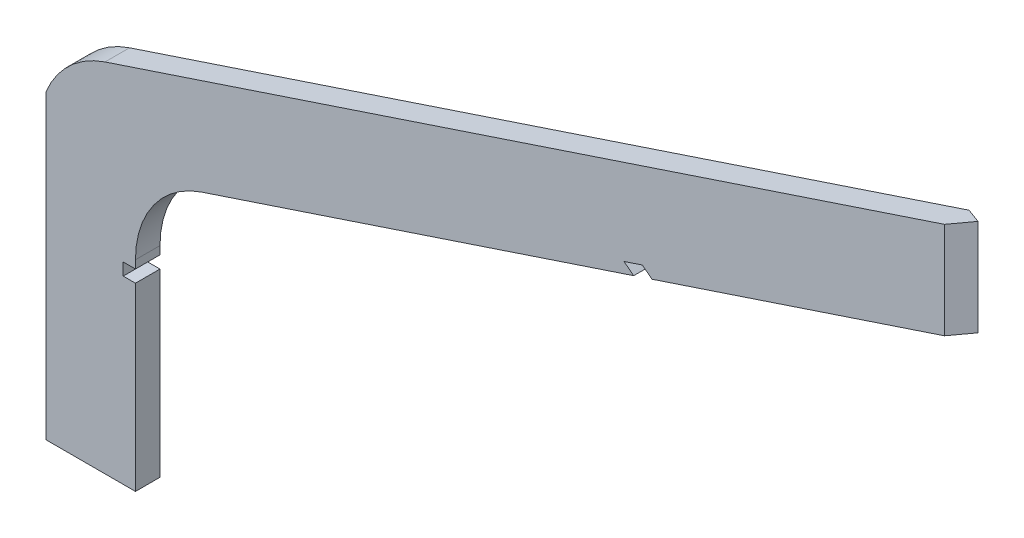
ISO-10303-21;
HEADER;
FILE_DESCRIPTION(('STEP AP214'),'2;1');
FILE_NAME('part.step','',(''),(''),'','','');
FILE_SCHEMA(('AUTOMOTIVE_DESIGN { 1 0 10303 214 1 1 1 1 }'));
ENDSEC;
DATA;
#1=APPLICATION_CONTEXT('core data for automotive mechanical design processes');
#2=APPLICATION_PROTOCOL_DEFINITION('international standard','automotive_design',2000,#1);
#3=PRODUCT_CONTEXT('',#1,'mechanical');
#4=PRODUCT('Part','Part','',(#3));
#5=PRODUCT_RELATED_PRODUCT_CATEGORY('part','',(#4));
#6=PRODUCT_DEFINITION_FORMATION('','',#4);
#7=PRODUCT_DEFINITION_CONTEXT('part definition',#1,'design');
#8=PRODUCT_DEFINITION('design','',#6,#7);
#9=PRODUCT_DEFINITION_SHAPE('','',#8);
#10=(LENGTH_UNIT() NAMED_UNIT(*) SI_UNIT(.MILLI.,.METRE.));
#11=(NAMED_UNIT(*) PLANE_ANGLE_UNIT() SI_UNIT($,.RADIAN.));
#12=(NAMED_UNIT(*) SI_UNIT($,.STERADIAN.) SOLID_ANGLE_UNIT());
#13=UNCERTAINTY_MEASURE_WITH_UNIT(LENGTH_MEASURE(1.E-05),#10,'distance_accuracy_value','');
#14=(GEOMETRIC_REPRESENTATION_CONTEXT(3) GLOBAL_UNCERTAINTY_ASSIGNED_CONTEXT((#13)) GLOBAL_UNIT_ASSIGNED_CONTEXT((#10,
#11,#12)) REPRESENTATION_CONTEXT('',''));
#15=CARTESIAN_POINT('',(0.,0.,0.));
#16=DIRECTION('',(0.,0.,1.));
#17=DIRECTION('',(1.,0.,0.));
#18=AXIS2_PLACEMENT_3D('',#15,#16,#17);
#19=CARTESIAN_POINT('',(-95.4802918979404,-80.7063865749167,-3.175));
#20=DIRECTION('',(-1.,0.,0.));
#21=DIRECTION('',(0.,0.,1.));
#22=AXIS2_PLACEMENT_3D('',#19,#20,#21);
#23=PLANE('',#22);
#24=DIRECTION('',(0.,1.,0.));
#25=VECTOR('',#24,1.);
#26=CARTESIAN_POINT('',(-95.4802918979404,-132.672742165113,-3.175));
#27=LINE('',#26,#25);
#28=CARTESIAN_POINT('',(-95.4802918979404,-132.672742165113,-3.175));
#29=VERTEX_POINT('',#28);
#30=CARTESIAN_POINT('',(-95.4802918979404,-85.9664921651128,-3.175));
#31=VERTEX_POINT('',#30);
#32=EDGE_CURVE('E285',#29,#31,#27,.T.);
#33=ORIENTED_EDGE('',*,*,#32,.T.);
#34=DIRECTION('',(0.,0.,1.));
#35=VECTOR('',#34,1.);
#36=CARTESIAN_POINT('',(-95.4802918979404,-85.9664921651128,-7.66512806053455));
#37=LINE('',#36,#35);
#38=CARTESIAN_POINT('',(-95.4802918979404,-85.9664921651128,3.175));
#39=VERTEX_POINT('',#38);
#40=EDGE_CURVE('E174',#31,#39,#37,.T.);
#41=ORIENTED_EDGE('',*,*,#40,.T.);
#42=DIRECTION('',(0.,1.,0.));
#43=VECTOR('',#42,1.);
#44=CARTESIAN_POINT('',(-95.4802918979404,-132.672742165113,3.175));
#45=LINE('',#44,#43);
#46=CARTESIAN_POINT('',(-95.4802918979404,-132.672742165113,3.175));
#47=VERTEX_POINT('',#46);
#48=EDGE_CURVE('E267',#47,#39,#45,.T.);
#49=ORIENTED_EDGE('',*,*,#48,.F.);
#50=DIRECTION('',(0.,0.,1.));
#51=VECTOR('',#50,1.);
#52=CARTESIAN_POINT('',(-95.4802918979404,-132.672742165113,-3.175));
#53=LINE('',#52,#51);
#54=EDGE_CURVE('E296',#29,#47,#53,.T.);
#55=ORIENTED_EDGE('',*,*,#54,.F.);
#56=EDGE_LOOP('',(#33,#41,#49,#55));
#57=FACE_BOUND('',#56,.T.);
#58=ADVANCED_FACE('F42',(#57),#23,.F.);
#59=CARTESIAN_POINT('',(-95.4802918979404,-64.0182857808747,-3.175));
#60=DIRECTION('',(0.,0.,-1.));
#61=DIRECTION('',(-1.,0.,0.));
#62=AXIS2_PLACEMENT_3D('',#59,#60,#61);
#63=PLANE('',#62);
#64=DIRECTION('',(1.,0.,0.));
#65=VECTOR('',#64,1.);
#66=CARTESIAN_POINT('',(-95.4802918979404,-85.9664921651128,-3.175));
#67=LINE('',#66,#65);
#68=CARTESIAN_POINT('',(-98.6552918979404,-85.9664921651128,-3.175));
#69=VERTEX_POINT('',#68);
#70=EDGE_CURVE('E168',#69,#31,#67,.T.);
#71=ORIENTED_EDGE('',*,*,#70,.T.);
#72=ORIENTED_EDGE('',*,*,#32,.F.);
#73=DIRECTION('',(1.,0.,0.));
#74=VECTOR('',#73,1.);
#75=CARTESIAN_POINT('',(-120.48029189794,-132.672742165113,-3.175));
#76=LINE('',#75,#74);
#77=CARTESIAN_POINT('',(-118.647204793263,-132.672742165113,-3.175));
#78=VERTEX_POINT('',#77);
#79=EDGE_CURVE('E282',#78,#29,#76,.T.);
#80=ORIENTED_EDGE('',*,*,#79,.F.);
#81=DIRECTION('',(0.,-1.,0.));
#82=VECTOR('',#81,1.);
#83=CARTESIAN_POINT('',(-118.647204793263,33.8095910061271,-3.175));
#84=LINE('',#83,#82);
#85=CARTESIAN_POINT('',(-118.647204793263,-54.6217892582063,-3.175));
#86=VERTEX_POINT('',#85);
#87=EDGE_CURVE('E243',#86,#78,#84,.T.);
#88=ORIENTED_EDGE('',*,*,#87,.F.);
#89=CARTESIAN_POINT('',(-95.4802918979404,-64.0182857808747,-3.175));
#90=DIRECTION('',(0.,0.,-1.));
#91=DIRECTION('',(-1.,0.,0.));
#92=AXIS2_PLACEMENT_3D('',#89,#90,#91);
#93=CIRCLE('',#92,25.);
#94=CARTESIAN_POINT('',(-103.367678211906,-40.2951085667184,-3.175));
#95=VERTEX_POINT('',#94);
#96=EDGE_CURVE('E279',#86,#95,#93,.T.);
#97=ORIENTED_EDGE('',*,*,#96,.T.);
#98=DIRECTION('',(-0.94892708856625,-0.315495452558639,0.));
#99=VECTOR('',#98,1.);
#100=CARTESIAN_POINT('',(119.51970810206,33.8095910061271,-3.175));
#101=LINE('',#100,#99);
#102=CARTESIAN_POINT('',(114.020446788028,31.981218776149,-3.175));
#103=VERTEX_POINT('',#102);
#104=EDGE_CURVE('E277',#103,#95,#101,.T.);
#105=ORIENTED_EDGE('',*,*,#104,.F.);
#106=DIRECTION('',(0.,-1.,0.));
#107=VECTOR('',#106,1.);
#108=CARTESIAN_POINT('',(114.020446788028,33.8095910061271,-3.175));
#109=LINE('',#108,#107);
#110=CARTESIAN_POINT('',(114.020446788028,6.98121877614899,-3.17500000000002));
#111=VERTEX_POINT('',#110);
#112=EDGE_CURVE('E213',#103,#111,#109,.T.);
#113=ORIENTED_EDGE('',*,*,#112,.T.);
#114=DIRECTION('',(0.94892708856625,0.315495452558639,0.));
#115=VECTOR('',#114,1.);
#116=CARTESIAN_POINT('',(-78.3676782119062,-56.9832093607602,-3.175));
#117=LINE('',#116,#115);
#118=CARTESIAN_POINT('',(38.2910947397079,-18.196970870177,-3.175));
#119=VERTEX_POINT('',#118);
#120=EDGE_CURVE('E273',#119,#111,#117,.T.);
#121=ORIENTED_EDGE('',*,*,#120,.F.);
#122=DIRECTION('',(0.794130517429638,-0.607747251155393,0.));
#123=VECTOR('',#122,1.);
#124=CARTESIAN_POINT('',(35.7697303468695,-16.2673733477591,-3.175));
#125=LINE('',#124,#123);
#126=CARTESIAN_POINT('',(35.7697303468695,-16.2673733477591,-3.175));
#127=VERTEX_POINT('',#126);
#128=EDGE_CURVE('E217',#127,#119,#125,.T.);
#129=ORIENTED_EDGE('',*,*,#128,.F.);
#130=DIRECTION('',(0.948927088566251,0.315495452558637,0.));
#131=VECTOR('',#130,1.);
#132=CARTESIAN_POINT('',(31.0250949040383,-17.8448506105523,-3.175));
#133=LINE('',#132,#131);
#134=CARTESIAN_POINT('',(31.0250949040383,-17.8448506105523,-3.175));
#135=VERTEX_POINT('',#134);
#136=EDGE_CURVE('E215',#135,#127,#133,.T.);
#137=ORIENTED_EDGE('',*,*,#136,.F.);
#138=DIRECTION('',(-0.794130517429636,0.607747251155395,0.));
#139=VECTOR('',#138,1.);
#140=CARTESIAN_POINT('',(33.5464592968767,-19.7744481329702,-3.175));
#141=LINE('',#140,#139);
#142=CARTESIAN_POINT('',(33.5464592968767,-19.7744481329702,-3.175));
#143=VERTEX_POINT('',#142);
#144=EDGE_CURVE('E202',#143,#135,#141,.T.);
#145=ORIENTED_EDGE('',*,*,#144,.F.);
#146=CARTESIAN_POINT('',(-78.3676782119062,-56.9832093607602,-3.175));
#147=VERTEX_POINT('',#146);
#148=EDGE_CURVE('E274',#147,#143,#117,.T.);
#149=ORIENTED_EDGE('',*,*,#148,.F.);
#150=CARTESIAN_POINT('',(-70.4802918979404,-80.7063865749165,-3.175));
#151=DIRECTION('',(0.,0.,-1.));
#152=DIRECTION('',(-1.,0.,0.));
#153=AXIS2_PLACEMENT_3D('',#150,#151,#152);
#154=CIRCLE('',#153,25.);
#155=CARTESIAN_POINT('',(-95.4802918979404,-80.7063865749167,-3.175));
#156=VERTEX_POINT('',#155);
#157=EDGE_CURVE('E287',#156,#147,#154,.T.);
#158=ORIENTED_EDGE('',*,*,#157,.F.);
#159=CARTESIAN_POINT('',(-95.4802918979404,-82.7914921651129,-3.175));
#160=VERTEX_POINT('',#159);
#161=EDGE_CURVE('E284',#160,#156,#27,.T.);
#162=ORIENTED_EDGE('',*,*,#161,.F.);
#163=DIRECTION('',(-1.,0.,0.));
#164=VECTOR('',#163,1.);
#165=CARTESIAN_POINT('',(-98.6552918979404,-82.7914921651129,-3.175));
#166=LINE('',#165,#164);
#167=CARTESIAN_POINT('',(-98.6552918979404,-82.7914921651129,-3.175));
#168=VERTEX_POINT('',#167);
#169=EDGE_CURVE('E57',#160,#168,#166,.T.);
#170=ORIENTED_EDGE('',*,*,#169,.T.);
#171=DIRECTION('',(0.,-1.,0.));
#172=VECTOR('',#171,1.);
#173=CARTESIAN_POINT('',(-98.6552918979404,-85.9664921651128,-3.175));
#174=LINE('',#173,#172);
#175=EDGE_CURVE('E182',#168,#69,#174,.T.);
#176=ORIENTED_EDGE('',*,*,#175,.T.);
#177=EDGE_LOOP('',(#71,#72,#80,#88,#97,#105,#113,#121,#129,#137,#145,#149,#158,#162,#170,#176));
#178=FACE_BOUND('',#177,.T.);
#179=ADVANCED_FACE('F187',(#178),#63,.T.);
#180=CARTESIAN_POINT('',(-78.3676782119062,-56.9832093607602,-3.175));
#181=DIRECTION('',(0.315495452558639,-0.94892708856625,0.));
#182=DIRECTION('',(0.94892708856625,0.315495452558639,0.));
#183=AXIS2_PLACEMENT_3D('',#180,#181,#182);
#184=PLANE('',#183);
#185=DIRECTION('',(0.94892708856625,0.315495452558639,0.));
#186=VECTOR('',#185,1.);
#187=CARTESIAN_POINT('',(-78.3676782119062,-56.9832093607602,3.175));
#188=LINE('',#187,#186);
#189=CARTESIAN_POINT('',(38.2910947397079,-18.196970870177,3.175));
#190=VERTEX_POINT('',#189);
#191=CARTESIAN_POINT('',(114.020446788028,6.981218776149,3.175));
#192=VERTEX_POINT('',#191);
#193=EDGE_CURVE('E255',#190,#192,#188,.T.);
#194=ORIENTED_EDGE('',*,*,#193,.F.);
#195=DIRECTION('',(0.,0.,1.));
#196=VECTOR('',#195,1.);
#197=CARTESIAN_POINT('',(38.2910947397079,-18.196970870177,-11.2431055496947));
#198=LINE('',#197,#196);
#199=EDGE_CURVE('E219',#119,#190,#198,.T.);
#200=ORIENTED_EDGE('',*,*,#199,.F.);
#201=ORIENTED_EDGE('',*,*,#120,.T.);
#202=DIRECTION('',(0.83221475542026,0.276691406590572,0.480479413065458));
#203=VECTOR('',#202,1.);
#204=CARTESIAN_POINT('',(-33.9528659485,-42.2163516493608,-88.607431941314));
#205=LINE('',#204,#203);
#206=CARTESIAN_POINT('',(119.51970810206,8.80959100612712,0.));
#207=VERTEX_POINT('',#206);
#208=EDGE_CURVE('E230',#111,#207,#205,.T.);
#209=ORIENTED_EDGE('',*,*,#208,.T.);
#210=DIRECTION('',(0.83221475542026,0.276691406590572,-0.480479413065458));
#211=VECTOR('',#210,1.);
#212=CARTESIAN_POINT('',(-31.4137418850976,-41.3721539179038,87.1414679798028));
#213=LINE('',#212,#211);
#214=EDGE_CURVE('E237',#192,#207,#213,.T.);
#215=ORIENTED_EDGE('',*,*,#214,.F.);
#216=EDGE_LOOP('',(#194,#200,#201,#209,#215));
#217=FACE_BOUND('',#216,.T.);
#218=ADVANCED_FACE('F44',(#217),#184,.T.);
#219=ORIENTED_EDGE('',*,*,#148,.T.);
#220=DIRECTION('',(0.,0.,1.));
#221=VECTOR('',#220,1.);
#222=CARTESIAN_POINT('',(33.5464592968767,-19.7744481329702,-11.2431055496947));
#223=LINE('',#222,#221);
#224=CARTESIAN_POINT('',(33.5464592968767,-19.7744481329702,3.175));
#225=VERTEX_POINT('',#224);
#226=EDGE_CURVE('E209',#143,#225,#223,.T.);
#227=ORIENTED_EDGE('',*,*,#226,.T.);
#228=CARTESIAN_POINT('',(-78.3676782119062,-56.9832093607602,3.175));
#229=VERTEX_POINT('',#228);
#230=EDGE_CURVE('E256',#229,#225,#188,.T.);
#231=ORIENTED_EDGE('',*,*,#230,.F.);
#232=DIRECTION('',(0.,0.,1.));
#233=VECTOR('',#232,1.);
#234=CARTESIAN_POINT('',(-78.3676782119062,-56.9832093607602,-3.175));
#235=LINE('',#234,#233);
#236=EDGE_CURVE('E291',#147,#229,#235,.T.);
#237=ORIENTED_EDGE('',*,*,#236,.F.);
#238=EDGE_LOOP('',(#219,#227,#231,#237));
#239=FACE_BOUND('',#238,.T.);
#240=ADVANCED_FACE('F329',(#239),#184,.T.);
#241=CARTESIAN_POINT('',(-95.4802918979404,-64.0182857808747,3.175));
#242=DIRECTION('',(0.,0.,-1.));
#243=DIRECTION('',(-1.,0.,0.));
#244=AXIS2_PLACEMENT_3D('',#241,#242,#243);
#245=PLANE('',#244);
#246=ORIENTED_EDGE('',*,*,#48,.T.);
#247=DIRECTION('',(1.,0.,0.));
#248=VECTOR('',#247,1.);
#249=CARTESIAN_POINT('',(-95.4802918979404,-85.9664921651128,3.175));
#250=LINE('',#249,#248);
#251=CARTESIAN_POINT('',(-98.6552918979404,-85.9664921651128,3.175));
#252=VERTEX_POINT('',#251);
#253=EDGE_CURVE('E189',#252,#39,#250,.T.);
#254=ORIENTED_EDGE('',*,*,#253,.F.);
#255=DIRECTION('',(0.,-1.,0.));
#256=VECTOR('',#255,1.);
#257=CARTESIAN_POINT('',(-98.6552918979404,-85.9664921651128,3.175));
#258=LINE('',#257,#256);
#259=CARTESIAN_POINT('',(-98.6552918979404,-82.7914921651129,3.175));
#260=VERTEX_POINT('',#259);
#261=EDGE_CURVE('E184',#260,#252,#258,.T.);
#262=ORIENTED_EDGE('',*,*,#261,.F.);
#263=DIRECTION('',(-1.,0.,0.));
#264=VECTOR('',#263,1.);
#265=CARTESIAN_POINT('',(-98.6552918979404,-82.7914921651129,3.175));
#266=LINE('',#265,#264);
#267=CARTESIAN_POINT('',(-95.4802918979404,-82.7914921651129,3.175));
#268=VERTEX_POINT('',#267);
#269=EDGE_CURVE('E194',#268,#260,#266,.T.);
#270=ORIENTED_EDGE('',*,*,#269,.F.);
#271=CARTESIAN_POINT('',(-95.4802918979404,-80.7063865749167,3.175));
#272=VERTEX_POINT('',#271);
#273=EDGE_CURVE('E266',#268,#272,#45,.T.);
#274=ORIENTED_EDGE('',*,*,#273,.T.);
#275=CARTESIAN_POINT('',(-70.4802918979404,-80.7063865749165,3.175));
#276=DIRECTION('',(0.,0.,-1.));
#277=DIRECTION('',(-1.,0.,0.));
#278=AXIS2_PLACEMENT_3D('',#275,#276,#277);
#279=CIRCLE('',#278,25.);
#280=EDGE_CURVE('E270',#272,#229,#279,.T.);
#281=ORIENTED_EDGE('',*,*,#280,.T.);
#282=ORIENTED_EDGE('',*,*,#230,.T.);
#283=DIRECTION('',(-0.794130517429636,0.607747251155395,0.));
#284=VECTOR('',#283,1.);
#285=CARTESIAN_POINT('',(33.5464592968767,-19.7744481329702,3.175));
#286=LINE('',#285,#284);
#287=CARTESIAN_POINT('',(31.0250949040383,-17.8448506105523,3.175));
#288=VERTEX_POINT('',#287);
#289=EDGE_CURVE('E210',#225,#288,#286,.T.);
#290=ORIENTED_EDGE('',*,*,#289,.T.);
#291=DIRECTION('',(0.948927088566251,0.315495452558637,0.));
#292=VECTOR('',#291,1.);
#293=CARTESIAN_POINT('',(31.0250949040383,-17.8448506105523,3.175));
#294=LINE('',#293,#292);
#295=CARTESIAN_POINT('',(35.7697303468695,-16.2673733477591,3.175));
#296=VERTEX_POINT('',#295);
#297=EDGE_CURVE('E65',#288,#296,#294,.T.);
#298=ORIENTED_EDGE('',*,*,#297,.T.);
#299=DIRECTION('',(0.794130517429638,-0.607747251155393,0.));
#300=VECTOR('',#299,1.);
#301=CARTESIAN_POINT('',(35.7697303468695,-16.2673733477591,3.175));
#302=LINE('',#301,#300);
#303=EDGE_CURVE('E203',#296,#190,#302,.T.);
#304=ORIENTED_EDGE('',*,*,#303,.T.);
#305=ORIENTED_EDGE('',*,*,#193,.T.);
#306=DIRECTION('',(0.,1.,0.));
#307=VECTOR('',#306,1.);
#308=CARTESIAN_POINT('',(114.020446788028,-64.0182857808747,3.175));
#309=LINE('',#308,#307);
#310=CARTESIAN_POINT('',(114.020446788028,31.981218776149,3.175));
#311=VERTEX_POINT('',#310);
#312=EDGE_CURVE('E11',#192,#311,#309,.T.);
#313=ORIENTED_EDGE('',*,*,#312,.T.);
#314=DIRECTION('',(-0.94892708856625,-0.315495452558639,0.));
#315=VECTOR('',#314,1.);
#316=CARTESIAN_POINT('',(119.51970810206,33.8095910061271,3.175));
#317=LINE('',#316,#315);
#318=CARTESIAN_POINT('',(-103.367678211906,-40.2951085667184,3.175));
#319=VERTEX_POINT('',#318);
#320=EDGE_CURVE('E259',#311,#319,#317,.T.);
#321=ORIENTED_EDGE('',*,*,#320,.T.);
#322=CARTESIAN_POINT('',(-95.4802918979404,-64.0182857808747,3.175));
#323=DIRECTION('',(0.,0.,-1.));
#324=DIRECTION('',(-1.,0.,0.));
#325=AXIS2_PLACEMENT_3D('',#322,#323,#324);
#326=CIRCLE('',#325,25.);
#327=CARTESIAN_POINT('',(-118.647204793263,-54.6217892582063,3.175));
#328=VERTEX_POINT('',#327);
#329=EDGE_CURVE('E261',#328,#319,#326,.T.);
#330=ORIENTED_EDGE('',*,*,#329,.F.);
#331=DIRECTION('',(0.,-1.,0.));
#332=VECTOR('',#331,1.);
#333=CARTESIAN_POINT('',(-118.647204793263,-64.0182857808747,3.175));
#334=LINE('',#333,#332);
#335=CARTESIAN_POINT('',(-118.647204793263,-132.672742165113,3.175));
#336=VERTEX_POINT('',#335);
#337=EDGE_CURVE('E50',#328,#336,#334,.T.);
#338=ORIENTED_EDGE('',*,*,#337,.T.);
#339=DIRECTION('',(1.,0.,0.));
#340=VECTOR('',#339,1.);
#341=CARTESIAN_POINT('',(-120.48029189794,-132.672742165113,3.175));
#342=LINE('',#341,#340);
#343=EDGE_CURVE('E264',#336,#47,#342,.T.);
#344=ORIENTED_EDGE('',*,*,#343,.T.);
#345=EDGE_LOOP('',(#246,#254,#262,#270,#274,#281,#282,#290,#298,#304,#305,#313,#321,#330,#338,#344));
#346=FACE_BOUND('',#345,.T.);
#347=ADVANCED_FACE('F304',(#346),#245,.F.);
#348=CARTESIAN_POINT('',(119.51970810206,33.8095910061271,-3.175));
#349=DIRECTION('',(-0.315495452558639,0.94892708856625,0.));
#350=DIRECTION('',(-0.94892708856625,-0.315495452558639,0.));
#351=AXIS2_PLACEMENT_3D('',#348,#349,#350);
#352=PLANE('',#351);
#353=DIRECTION('',(-0.83221475542026,-0.276691406590572,0.480479413065458));
#354=VECTOR('',#353,1.);
#355=CARTESIAN_POINT('',(120.789270133761,34.2316898718556,-0.732981980755634));
#356=LINE('',#355,#354);
#357=CARTESIAN_POINT('',(119.51970810206,33.8095910061271,0.));
#358=VERTEX_POINT('',#357);
#359=EDGE_CURVE('E235',#358,#311,#356,.T.);
#360=ORIENTED_EDGE('',*,*,#359,.F.);
#361=DIRECTION('',(-0.83221475542026,-0.276691406590572,-0.480479413065458));
#362=VECTOR('',#361,1.);
#363=CARTESIAN_POINT('',(118.250146070358,33.3874921403986,-0.732981980755634));
#364=LINE('',#363,#362);
#365=EDGE_CURVE('E227',#358,#103,#364,.T.);
#366=ORIENTED_EDGE('',*,*,#365,.T.);
#367=ORIENTED_EDGE('',*,*,#104,.T.);
#368=DIRECTION('',(0.,0.,1.));
#369=VECTOR('',#368,1.);
#370=CARTESIAN_POINT('',(-103.367678211906,-40.2951085667184,-3.175));
#371=LINE('',#370,#369);
#372=EDGE_CURVE('E290',#95,#319,#371,.T.);
#373=ORIENTED_EDGE('',*,*,#372,.T.);
#374=ORIENTED_EDGE('',*,*,#320,.F.);
#375=EDGE_LOOP('',(#360,#366,#367,#373,#374));
#376=FACE_BOUND('',#375,.T.);
#377=ADVANCED_FACE('F352',(#376),#352,.T.);
#378=CARTESIAN_POINT('',(-120.48029189794,-132.672742165113,-3.175));
#379=DIRECTION('',(0.,-1.,0.));
#380=DIRECTION('',(0.,0.,-1.));
#381=AXIS2_PLACEMENT_3D('',#378,#379,#380);
#382=PLANE('',#381);
#383=DIRECTION('',(0.499999999999999,0.,0.866025403784439));
#384=VECTOR('',#383,1.);
#385=CARTESIAN_POINT('',(-120.48029189794,-132.672742165113,0.));
#386=LINE('',#385,#384);
#387=CARTESIAN_POINT('',(-120.48029189794,-132.672742165113,0.));
#388=VERTEX_POINT('',#387);
#389=EDGE_CURVE('E247',#388,#336,#386,.T.);
#390=ORIENTED_EDGE('',*,*,#389,.F.);
#391=DIRECTION('',(0.499999999999999,0.,-0.866025403784439));
#392=VECTOR('',#391,1.);
#393=CARTESIAN_POINT('',(-120.48029189794,-132.672742165113,0.));
#394=LINE('',#393,#392);
#395=EDGE_CURVE('E240',#388,#78,#394,.T.);
#396=ORIENTED_EDGE('',*,*,#395,.T.);
#397=ORIENTED_EDGE('',*,*,#79,.T.);
#398=ORIENTED_EDGE('',*,*,#54,.T.);
#399=ORIENTED_EDGE('',*,*,#343,.F.);
#400=EDGE_LOOP('',(#390,#396,#397,#398,#399));
#401=FACE_BOUND('',#400,.T.);
#402=ADVANCED_FACE('F309',(#401),#382,.T.);
#403=CARTESIAN_POINT('',(-95.4802918979404,-64.0182857808747,-3.175));
#404=DIRECTION('',(0.,0.,1.));
#405=DIRECTION('',(1.,0.,0.));
#406=AXIS2_PLACEMENT_3D('',#403,#404,#405);
#407=CYLINDRICAL_SURFACE('',#406,25.);
#408=CARTESIAN_POINT('',(-95.4802918979404,-64.0182857808747,-43.3012701892221));
#409=DIRECTION('',(-0.866025403784439,0.,-0.499999999999999));
#410=DIRECTION('',(-0.499999999999999,0.,0.86602540378444));
#411=AXIS2_PLACEMENT_3D('',#408,#409,#410);
#412=ELLIPSE('',#411,50.0000000000001,25.);
#413=CARTESIAN_POINT('',(-120.48029189794,-64.0182857808747,0.));
#414=VERTEX_POINT('',#413);
#415=EDGE_CURVE('E245',#414,#86,#412,.T.);
#416=ORIENTED_EDGE('',*,*,#415,.F.);
#417=CARTESIAN_POINT('',(-95.4802918979404,-64.0182857808747,43.3012701892221));
#418=DIRECTION('',(0.866025403784439,0.,-0.499999999999999));
#419=DIRECTION('',(0.499999999999999,0.,0.86602540378444));
#420=AXIS2_PLACEMENT_3D('',#417,#418,#419);
#421=ELLIPSE('',#420,50.0000000000001,25.);
#422=EDGE_CURVE('E252',#414,#328,#421,.T.);
#423=ORIENTED_EDGE('',*,*,#422,.T.);
#424=ORIENTED_EDGE('',*,*,#329,.T.);
#425=ORIENTED_EDGE('',*,*,#372,.F.);
#426=ORIENTED_EDGE('',*,*,#96,.F.);
#427=EDGE_LOOP('',(#416,#423,#424,#425,#426));
#428=FACE_BOUND('',#427,.T.);
#429=ADVANCED_FACE('F358',(#428),#407,.T.);
#430=CARTESIAN_POINT('',(-70.4802918979404,-80.7063865749165,-3.175));
#431=DIRECTION('',(0.,0.,1.));
#432=DIRECTION('',(1.,0.,0.));
#433=AXIS2_PLACEMENT_3D('',#430,#431,#432);
#434=CYLINDRICAL_SURFACE('',#433,25.);
#435=ORIENTED_EDGE('',*,*,#236,.T.);
#436=ORIENTED_EDGE('',*,*,#280,.F.);
#437=DIRECTION('',(0.,0.,1.));
#438=VECTOR('',#437,1.);
#439=CARTESIAN_POINT('',(-95.4802918979404,-80.7063865749167,-3.175));
#440=LINE('',#439,#438);
#441=EDGE_CURVE('E293',#156,#272,#440,.T.);
#442=ORIENTED_EDGE('',*,*,#441,.F.);
#443=ORIENTED_EDGE('',*,*,#157,.T.);
#444=EDGE_LOOP('',(#435,#436,#442,#443));
#445=FACE_BOUND('',#444,.T.);
#446=ADVANCED_FACE('F325',(#445),#434,.F.);
#447=ORIENTED_EDGE('',*,*,#273,.F.);
#448=DIRECTION('',(0.,0.,1.));
#449=VECTOR('',#448,1.);
#450=CARTESIAN_POINT('',(-95.4802918979404,-82.7914921651129,-7.66512806053455));
#451=LINE('',#450,#449);
#452=EDGE_CURVE('E197',#160,#268,#451,.T.);
#453=ORIENTED_EDGE('',*,*,#452,.F.);
#454=ORIENTED_EDGE('',*,*,#161,.T.);
#455=ORIENTED_EDGE('',*,*,#441,.T.);
#456=EDGE_LOOP('',(#447,#453,#454,#455));
#457=FACE_BOUND('',#456,.T.);
#458=ADVANCED_FACE('F319',(#457),#23,.F.);
#459=CARTESIAN_POINT('',(-120.48029189794,33.8095910061271,0.));
#460=DIRECTION('',(0.866025403784439,0.,-0.499999999999999));
#461=DIRECTION('',(-0.499999999999999,0.,-0.86602540378444));
#462=AXIS2_PLACEMENT_3D('',#459,#460,#461);
#463=PLANE('',#462);
#464=DIRECTION('',(0.,-1.,0.));
#465=VECTOR('',#464,1.);
#466=CARTESIAN_POINT('',(-120.48029189794,33.8095910061271,0.));
#467=LINE('',#466,#465);
#468=EDGE_CURVE('E249',#414,#388,#467,.T.);
#469=ORIENTED_EDGE('',*,*,#468,.T.);
#470=ORIENTED_EDGE('',*,*,#389,.T.);
#471=ORIENTED_EDGE('',*,*,#337,.F.);
#472=ORIENTED_EDGE('',*,*,#422,.F.);
#473=EDGE_LOOP('',(#469,#470,#471,#472));
#474=FACE_BOUND('',#473,.T.);
#475=ADVANCED_FACE('F359',(#474),#463,.F.);
#476=CARTESIAN_POINT('',(-120.48029189794,33.8095910061271,0.));
#477=DIRECTION('',(-0.866025403784439,0.,-0.499999999999999));
#478=DIRECTION('',(-0.499999999999999,0.,0.86602540378444));
#479=AXIS2_PLACEMENT_3D('',#476,#477,#478);
#480=PLANE('',#479);
#481=ORIENTED_EDGE('',*,*,#415,.T.);
#482=ORIENTED_EDGE('',*,*,#87,.T.);
#483=ORIENTED_EDGE('',*,*,#395,.F.);
#484=ORIENTED_EDGE('',*,*,#468,.F.);
#485=EDGE_LOOP('',(#481,#482,#483,#484));
#486=FACE_BOUND('',#485,.T.);
#487=ADVANCED_FACE('F361',(#486),#480,.T.);
#488=CARTESIAN_POINT('',(119.51970810206,33.8095910061271,0.));
#489=DIRECTION('',(-0.499999999999994,0.,-0.866025403784442));
#490=DIRECTION('',(-0.866025403784442,0.,0.499999999999994));
#491=AXIS2_PLACEMENT_3D('',#488,#489,#490);
#492=PLANE('',#491);
#493=ORIENTED_EDGE('',*,*,#214,.T.);
#494=DIRECTION('',(0.,-1.,0.));
#495=VECTOR('',#494,1.);
#496=CARTESIAN_POINT('',(119.51970810206,33.8095910061271,0.));
#497=LINE('',#496,#495);
#498=EDGE_CURVE('E233',#358,#207,#497,.T.);
#499=ORIENTED_EDGE('',*,*,#498,.F.);
#500=ORIENTED_EDGE('',*,*,#359,.T.);
#501=ORIENTED_EDGE('',*,*,#312,.F.);
#502=EDGE_LOOP('',(#493,#499,#500,#501));
#503=FACE_BOUND('',#502,.T.);
#504=ADVANCED_FACE('F348',(#503),#492,.F.);
#505=CARTESIAN_POINT('',(119.51970810206,33.8095910061271,0.));
#506=DIRECTION('',(0.499999999999994,0.,-0.866025403784442));
#507=DIRECTION('',(-0.866025403784442,0.,-0.499999999999994));
#508=AXIS2_PLACEMENT_3D('',#505,#506,#507);
#509=PLANE('',#508);
#510=ORIENTED_EDGE('',*,*,#112,.F.);
#511=ORIENTED_EDGE('',*,*,#365,.F.);
#512=ORIENTED_EDGE('',*,*,#498,.T.);
#513=ORIENTED_EDGE('',*,*,#208,.F.);
#514=EDGE_LOOP('',(#510,#511,#512,#513));
#515=FACE_BOUND('',#514,.T.);
#516=ADVANCED_FACE('F364',(#515),#509,.T.);
#517=CARTESIAN_POINT('',(35.7697303468695,-16.2673733477591,-11.2431055496947));
#518=DIRECTION('',(-0.607747251155393,-0.794130517429638,0.));
#519=DIRECTION('',(0.794130517429638,-0.607747251155393,0.));
#520=AXIS2_PLACEMENT_3D('',#517,#518,#519);
#521=PLANE('',#520);
#522=ORIENTED_EDGE('',*,*,#128,.T.);
#523=ORIENTED_EDGE('',*,*,#199,.T.);
#524=ORIENTED_EDGE('',*,*,#303,.F.);
#525=DIRECTION('',(0.,0.,1.));
#526=VECTOR('',#525,1.);
#527=CARTESIAN_POINT('',(35.7697303468695,-16.2673733477591,-11.2431055496947));
#528=LINE('',#527,#526);
#529=EDGE_CURVE('E207',#127,#296,#528,.T.);
#530=ORIENTED_EDGE('',*,*,#529,.F.);
#531=EDGE_LOOP('',(#522,#523,#524,#530));
#532=FACE_BOUND('',#531,.T.);
#533=ADVANCED_FACE('F339',(#532),#521,.T.);
#534=CARTESIAN_POINT('',(31.0250949040383,-17.8448506105523,-11.2431055496947));
#535=DIRECTION('',(0.315495452558637,-0.948927088566251,0.));
#536=DIRECTION('',(0.948927088566251,0.315495452558637,0.));
#537=AXIS2_PLACEMENT_3D('',#534,#535,#536);
#538=PLANE('',#537);
#539=ORIENTED_EDGE('',*,*,#136,.T.);
#540=ORIENTED_EDGE('',*,*,#529,.T.);
#541=ORIENTED_EDGE('',*,*,#297,.F.);
#542=DIRECTION('',(0.,0.,1.));
#543=VECTOR('',#542,1.);
#544=CARTESIAN_POINT('',(31.0250949040383,-17.8448506105523,-11.2431055496947));
#545=LINE('',#544,#543);
#546=EDGE_CURVE('E206',#135,#288,#545,.T.);
#547=ORIENTED_EDGE('',*,*,#546,.F.);
#548=EDGE_LOOP('',(#539,#540,#541,#547));
#549=FACE_BOUND('',#548,.T.);
#550=ADVANCED_FACE('F336',(#549),#538,.T.);
#551=CARTESIAN_POINT('',(33.5464592968767,-19.7744481329702,-11.2431055496947));
#552=DIRECTION('',(0.607747251155395,0.794130517429636,0.));
#553=DIRECTION('',(-0.794130517429636,0.607747251155395,0.));
#554=AXIS2_PLACEMENT_3D('',#551,#552,#553);
#555=PLANE('',#554);
#556=ORIENTED_EDGE('',*,*,#144,.T.);
#557=ORIENTED_EDGE('',*,*,#546,.T.);
#558=ORIENTED_EDGE('',*,*,#289,.F.);
#559=ORIENTED_EDGE('',*,*,#226,.F.);
#560=EDGE_LOOP('',(#556,#557,#558,#559));
#561=FACE_BOUND('',#560,.T.);
#562=ADVANCED_FACE('F331',(#561),#555,.T.);
#563=CARTESIAN_POINT('',(-98.6552918979404,-85.9664921651128,-7.66512806053455));
#564=DIRECTION('',(-1.,0.,0.));
#565=DIRECTION('',(0.,0.,1.));
#566=AXIS2_PLACEMENT_3D('',#563,#564,#565);
#567=PLANE('',#566);
#568=DIRECTION('',(0.,0.,1.));
#569=VECTOR('',#568,1.);
#570=CARTESIAN_POINT('',(-98.6552918979404,-82.7914921651129,-7.66512806053455));
#571=LINE('',#570,#569);
#572=EDGE_CURVE('E196',#168,#260,#571,.T.);
#573=ORIENTED_EDGE('',*,*,#572,.T.);
#574=ORIENTED_EDGE('',*,*,#261,.T.);
#575=DIRECTION('',(0.,0.,1.));
#576=VECTOR('',#575,1.);
#577=CARTESIAN_POINT('',(-98.6552918979404,-85.9664921651128,-7.66512806053455));
#578=LINE('',#577,#576);
#579=EDGE_CURVE('E171',#69,#252,#578,.T.);
#580=ORIENTED_EDGE('',*,*,#579,.F.);
#581=ORIENTED_EDGE('',*,*,#175,.F.);
#582=EDGE_LOOP('',(#573,#574,#580,#581));
#583=FACE_BOUND('',#582,.T.);
#584=ADVANCED_FACE('F181',(#583),#567,.F.);
#585=CARTESIAN_POINT('',(-95.4802918979404,-85.9664921651128,-7.66512806053455));
#586=DIRECTION('',(0.,-1.,0.));
#587=DIRECTION('',(0.,0.,-1.));
#588=AXIS2_PLACEMENT_3D('',#585,#586,#587);
#589=PLANE('',#588);
#590=ORIENTED_EDGE('',*,*,#579,.T.);
#591=ORIENTED_EDGE('',*,*,#253,.T.);
#592=ORIENTED_EDGE('',*,*,#40,.F.);
#593=ORIENTED_EDGE('',*,*,#70,.F.);
#594=EDGE_LOOP('',(#590,#591,#592,#593));
#595=FACE_BOUND('',#594,.T.);
#596=ADVANCED_FACE('F170',(#595),#589,.F.);
#597=CARTESIAN_POINT('',(-98.6552918979404,-82.7914921651129,-7.66512806053455));
#598=DIRECTION('',(0.,1.,0.));
#599=DIRECTION('',(0.,0.,1.));
#600=AXIS2_PLACEMENT_3D('',#597,#598,#599);
#601=PLANE('',#600);
#602=ORIENTED_EDGE('',*,*,#452,.T.);
#603=ORIENTED_EDGE('',*,*,#269,.T.);
#604=ORIENTED_EDGE('',*,*,#572,.F.);
#605=ORIENTED_EDGE('',*,*,#169,.F.);
#606=EDGE_LOOP('',(#602,#603,#604,#605));
#607=FACE_BOUND('',#606,.T.);
#608=ADVANCED_FACE('F317',(#607),#601,.F.);
#609=CLOSED_SHELL('',(#58,#179,#218,#240,#347,#377,#402,#429,#446,#458,#475,#487,#504,#516,#533,
#550,#562,#584,#596,#608));
#610=MANIFOLD_SOLID_BREP('B2',#609);
#611=ADVANCED_BREP_SHAPE_REPRESENTATION('',(#18,#610),#14);
#612=SHAPE_DEFINITION_REPRESENTATION(#9,#611);
ENDSEC;
END-ISO-10303-21;
